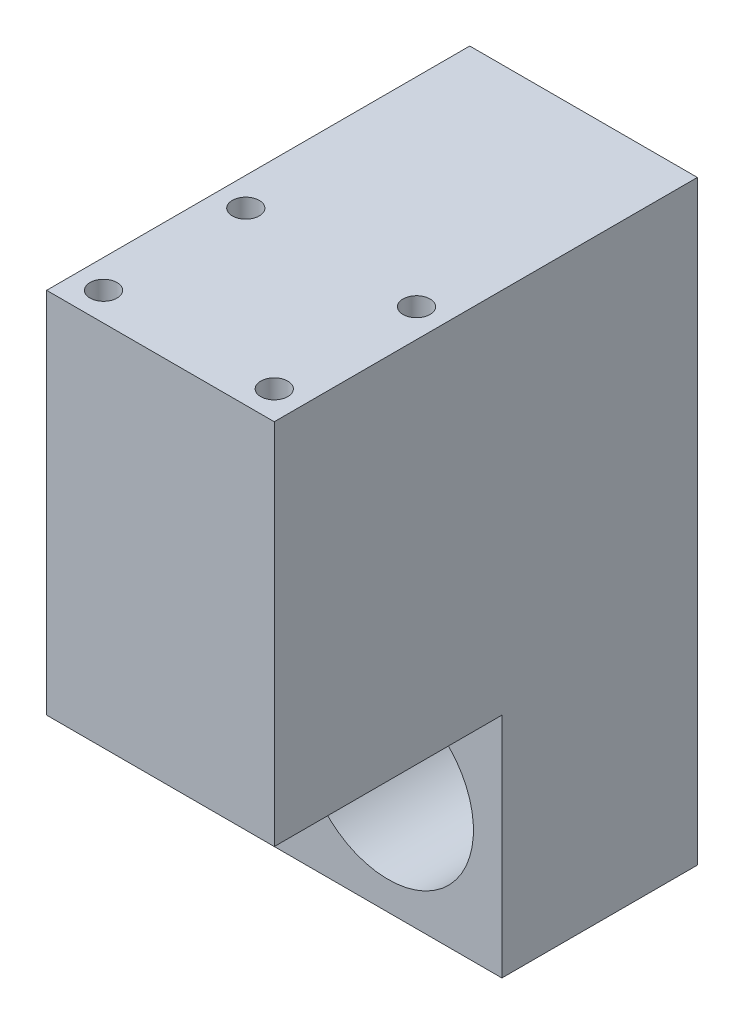
ISO-10303-21;
HEADER;
FILE_DESCRIPTION(('STEP AP214'),'2;1');
FILE_NAME('part.step','',(''),(''),'','','');
FILE_SCHEMA(('AUTOMOTIVE_DESIGN { 1 0 10303 214 1 1 1 1 }'));
ENDSEC;
DATA;
#1=APPLICATION_CONTEXT('core data for automotive mechanical design processes');
#2=APPLICATION_PROTOCOL_DEFINITION('international standard','automotive_design',2000,#1);
#3=PRODUCT_CONTEXT('',#1,'mechanical');
#4=PRODUCT('Part','Part','',(#3));
#5=PRODUCT_RELATED_PRODUCT_CATEGORY('part','',(#4));
#6=PRODUCT_DEFINITION_FORMATION('','',#4);
#7=PRODUCT_DEFINITION_CONTEXT('part definition',#1,'design');
#8=PRODUCT_DEFINITION('design','',#6,#7);
#9=PRODUCT_DEFINITION_SHAPE('','',#8);
#10=(LENGTH_UNIT() NAMED_UNIT(*) SI_UNIT(.MILLI.,.METRE.));
#11=(NAMED_UNIT(*) PLANE_ANGLE_UNIT() SI_UNIT($,.RADIAN.));
#12=(NAMED_UNIT(*) SI_UNIT($,.STERADIAN.) SOLID_ANGLE_UNIT());
#13=UNCERTAINTY_MEASURE_WITH_UNIT(LENGTH_MEASURE(1.E-05),#10,'distance_accuracy_value','');
#14=(GEOMETRIC_REPRESENTATION_CONTEXT(3) GLOBAL_UNCERTAINTY_ASSIGNED_CONTEXT((#13)) GLOBAL_UNIT_ASSIGNED_CONTEXT((#10,
#11,#12)) REPRESENTATION_CONTEXT('',''));
#15=CARTESIAN_POINT('',(0.,0.,0.));
#16=DIRECTION('',(0.,0.,1.));
#17=DIRECTION('',(1.,0.,0.));
#18=AXIS2_PLACEMENT_3D('',#15,#16,#17);
#19=CARTESIAN_POINT('',(-18.3087248322148,8.,2.98570469798658));
#20=DIRECTION('',(0.,0.,1.));
#21=DIRECTION('',(1.,0.,0.));
#22=AXIS2_PLACEMENT_3D('',#19,#20,#21);
#23=PLANE('',#22);
#24=DIRECTION('',(-1.,0.,0.));
#25=VECTOR('',#24,1.);
#26=CARTESIAN_POINT('',(-18.3087248322148,0.,2.98570469798658));
#27=LINE('',#26,#25);
#28=CARTESIAN_POINT('',(-10.3087248322148,0.,2.98570469798658));
#29=VERTEX_POINT('',#28);
#30=CARTESIAN_POINT('',(-18.3087248322148,0.,2.98570469798658));
#31=VERTEX_POINT('',#30);
#32=EDGE_CURVE('E89',#29,#31,#27,.T.);
#33=ORIENTED_EDGE('',*,*,#32,.T.);
#34=DIRECTION('',(0.,-1.,0.));
#35=VECTOR('',#34,1.);
#36=CARTESIAN_POINT('',(-18.3087248322148,8.,2.98570469798658));
#37=LINE('',#36,#35);
#38=CARTESIAN_POINT('',(-18.3087248322148,20.93,2.98570469798658));
#39=VERTEX_POINT('',#38);
#40=EDGE_CURVE('E99',#39,#31,#37,.T.);
#41=ORIENTED_EDGE('',*,*,#40,.F.);
#42=DIRECTION('',(-1.,0.,0.));
#43=VECTOR('',#42,1.);
#44=CARTESIAN_POINT('',(-18.3087248322148,20.93,2.98570469798658));
#45=LINE('',#44,#43);
#46=CARTESIAN_POINT('',(-10.3087248322148,20.93,2.98570469798658));
#47=VERTEX_POINT('',#46);
#48=EDGE_CURVE('E97',#47,#39,#45,.T.);
#49=ORIENTED_EDGE('',*,*,#48,.F.);
#50=DIRECTION('',(0.,-1.,0.));
#51=VECTOR('',#50,1.);
#52=CARTESIAN_POINT('',(-10.3087248322148,8.,2.98570469798658));
#53=LINE('',#52,#51);
#54=EDGE_CURVE('E84',#47,#29,#53,.T.);
#55=ORIENTED_EDGE('',*,*,#54,.T.);
#56=EDGE_LOOP('',(#33,#41,#49,#55));
#57=FACE_BOUND('',#56,.T.);
#58=CARTESIAN_POINT('',(-14.3087248322148,4.,2.98570469798657));
#59=DIRECTION('',(0.,0.,-1.));
#60=DIRECTION('',(-1.,0.,0.));
#61=AXIS2_PLACEMENT_3D('',#58,#59,#60);
#62=CIRCLE('',#61,2.99999999999999);
#63=CARTESIAN_POINT('',(-17.3087248322148,4.,2.98570469798657));
#64=VERTEX_POINT('',#63);
#65=EDGE_CURVE('E186',#64,#64,#62,.T.);
#66=ORIENTED_EDGE('',*,*,#65,.F.);
#67=EDGE_LOOP('',(#66));
#68=FACE_BOUND('',#67,.T.);
#69=ADVANCED_FACE('F50',(#57,#68),#23,.F.);
#70=CARTESIAN_POINT('',(-18.3087248322148,8.,9.85570469798658));
#71=DIRECTION('',(1.,0.,0.));
#72=DIRECTION('',(0.,0.,-1.));
#73=AXIS2_PLACEMENT_3D('',#70,#71,#72);
#74=PLANE('',#73);
#75=DIRECTION('',(0.,0.,1.));
#76=VECTOR('',#75,1.);
#77=CARTESIAN_POINT('',(-18.3087248322148,0.,9.85570469798658));
#78=LINE('',#77,#76);
#79=CARTESIAN_POINT('',(-18.3087248322148,0.,9.85570469798658));
#80=VERTEX_POINT('',#79);
#81=EDGE_CURVE('E104',#31,#80,#78,.T.);
#82=ORIENTED_EDGE('',*,*,#81,.T.);
#83=DIRECTION('',(0.,-1.,0.));
#84=VECTOR('',#83,1.);
#85=CARTESIAN_POINT('',(-18.3087248322148,8.,9.85570469798658));
#86=LINE('',#85,#84);
#87=CARTESIAN_POINT('',(-18.3087248322148,8.,9.85570469798658));
#88=VERTEX_POINT('',#87);
#89=EDGE_CURVE('E11',#88,#80,#86,.T.);
#90=ORIENTED_EDGE('',*,*,#89,.F.);
#91=DIRECTION('',(0.,0.,1.));
#92=VECTOR('',#91,1.);
#93=CARTESIAN_POINT('',(-18.3087248322148,8.,2.98570469798658));
#94=LINE('',#93,#92);
#95=CARTESIAN_POINT('',(-18.3087248322148,8.,17.8557046979866));
#96=VERTEX_POINT('',#95);
#97=EDGE_CURVE('E134',#88,#96,#94,.T.);
#98=ORIENTED_EDGE('',*,*,#97,.T.);
#99=DIRECTION('',(0.,-1.,0.));
#100=VECTOR('',#99,1.);
#101=CARTESIAN_POINT('',(-18.3087248322148,20.93,17.8557046979866));
#102=LINE('',#101,#100);
#103=CARTESIAN_POINT('',(-18.3087248322148,20.93,17.8557046979866));
#104=VERTEX_POINT('',#103);
#105=EDGE_CURVE('E124',#104,#96,#102,.T.);
#106=ORIENTED_EDGE('',*,*,#105,.F.);
#107=DIRECTION('',(0.,0.,1.));
#108=VECTOR('',#107,1.);
#109=CARTESIAN_POINT('',(-18.3087248322148,20.93,2.98570469798658));
#110=LINE('',#109,#108);
#111=EDGE_CURVE('E113',#39,#104,#110,.T.);
#112=ORIENTED_EDGE('',*,*,#111,.F.);
#113=ORIENTED_EDGE('',*,*,#40,.T.);
#114=EDGE_LOOP('',(#82,#90,#98,#106,#112,#113));
#115=FACE_BOUND('',#114,.T.);
#116=ADVANCED_FACE('F47',(#115),#74,.F.);
#117=CARTESIAN_POINT('',(-18.3087248322148,8.,9.85570469798658));
#118=DIRECTION('',(0.,0.,-1.));
#119=DIRECTION('',(-1.,0.,0.));
#120=AXIS2_PLACEMENT_3D('',#117,#118,#119);
#121=PLANE('',#120);
#122=CARTESIAN_POINT('',(-14.3087248322148,4.,9.85570469798658));
#123=DIRECTION('',(0.,0.,-1.));
#124=DIRECTION('',(-1.,0.,0.));
#125=AXIS2_PLACEMENT_3D('',#122,#123,#124);
#126=CIRCLE('',#125,2.99999999999999);
#127=CARTESIAN_POINT('',(-17.3087248322148,4.,9.85570469798658));
#128=VERTEX_POINT('',#127);
#129=EDGE_CURVE('E184',#128,#128,#126,.T.);
#130=ORIENTED_EDGE('',*,*,#129,.T.);
#131=EDGE_LOOP('',(#130));
#132=FACE_BOUND('',#131,.T.);
#133=DIRECTION('',(1.,0.,0.));
#134=VECTOR('',#133,1.);
#135=CARTESIAN_POINT('',(-18.3087248322148,0.,9.85570469798658));
#136=LINE('',#135,#134);
#137=CARTESIAN_POINT('',(-10.3087248322148,0.,9.85570469798658));
#138=VERTEX_POINT('',#137);
#139=EDGE_CURVE('E93',#80,#138,#136,.T.);
#140=ORIENTED_EDGE('',*,*,#139,.T.);
#141=DIRECTION('',(0.,-1.,0.));
#142=VECTOR('',#141,1.);
#143=CARTESIAN_POINT('',(-10.3087248322148,8.,9.85570469798658));
#144=LINE('',#143,#142);
#145=CARTESIAN_POINT('',(-10.3087248322148,8.,9.85570469798658));
#146=VERTEX_POINT('',#145);
#147=EDGE_CURVE('E57',#146,#138,#144,.T.);
#148=ORIENTED_EDGE('',*,*,#147,.F.);
#149=DIRECTION('',(1.,0.,0.));
#150=VECTOR('',#149,1.);
#151=CARTESIAN_POINT('',(-18.3087248322148,8.,9.85570469798658));
#152=LINE('',#151,#150);
#153=EDGE_CURVE('E61',#88,#146,#152,.T.);
#154=ORIENTED_EDGE('',*,*,#153,.F.);
#155=ORIENTED_EDGE('',*,*,#89,.T.);
#156=EDGE_LOOP('',(#140,#148,#154,#155));
#157=FACE_BOUND('',#156,.T.);
#158=ADVANCED_FACE('F142',(#132,#157),#121,.F.);
#159=CARTESIAN_POINT('',(-10.3087248322148,8.,9.85570469798658));
#160=DIRECTION('',(-1.,0.,0.));
#161=DIRECTION('',(0.,0.,1.));
#162=AXIS2_PLACEMENT_3D('',#159,#160,#161);
#163=PLANE('',#162);
#164=DIRECTION('',(0.,0.,-1.));
#165=VECTOR('',#164,1.);
#166=CARTESIAN_POINT('',(-10.3087248322148,0.,9.85570469798658));
#167=LINE('',#166,#165);
#168=EDGE_CURVE('E77',#138,#29,#167,.T.);
#169=ORIENTED_EDGE('',*,*,#168,.T.);
#170=ORIENTED_EDGE('',*,*,#54,.F.);
#171=DIRECTION('',(0.,0.,-1.));
#172=VECTOR('',#171,1.);
#173=CARTESIAN_POINT('',(-10.3087248322148,20.93,2.98570469798658));
#174=LINE('',#173,#172);
#175=CARTESIAN_POINT('',(-10.3087248322148,20.93,17.8557046979866));
#176=VERTEX_POINT('',#175);
#177=EDGE_CURVE('E121',#176,#47,#174,.T.);
#178=ORIENTED_EDGE('',*,*,#177,.F.);
#179=DIRECTION('',(0.,-1.,0.));
#180=VECTOR('',#179,1.);
#181=CARTESIAN_POINT('',(-10.3087248322148,20.93,17.8557046979866));
#182=LINE('',#181,#180);
#183=CARTESIAN_POINT('',(-10.3087248322148,8.,17.8557046979866));
#184=VERTEX_POINT('',#183);
#185=EDGE_CURVE('E125',#176,#184,#182,.T.);
#186=ORIENTED_EDGE('',*,*,#185,.T.);
#187=DIRECTION('',(0.,0.,-1.));
#188=VECTOR('',#187,1.);
#189=CARTESIAN_POINT('',(-10.3087248322148,8.,2.98570469798658));
#190=LINE('',#189,#188);
#191=EDGE_CURVE('E137',#184,#146,#190,.T.);
#192=ORIENTED_EDGE('',*,*,#191,.T.);
#193=ORIENTED_EDGE('',*,*,#147,.T.);
#194=EDGE_LOOP('',(#169,#170,#178,#186,#192,#193));
#195=FACE_BOUND('',#194,.T.);
#196=ADVANCED_FACE('F85',(#195),#163,.F.);
#197=CARTESIAN_POINT('',(0.,0.,0.));
#198=DIRECTION('',(0.,-1.,0.));
#199=DIRECTION('',(0.,0.,-1.));
#200=AXIS2_PLACEMENT_3D('',#197,#198,#199);
#201=PLANE('',#200);
#202=ORIENTED_EDGE('',*,*,#81,.F.);
#203=ORIENTED_EDGE('',*,*,#32,.F.);
#204=ORIENTED_EDGE('',*,*,#168,.F.);
#205=ORIENTED_EDGE('',*,*,#139,.F.);
#206=EDGE_LOOP('',(#202,#203,#204,#205));
#207=FACE_BOUND('',#206,.T.);
#208=ADVANCED_FACE('F103',(#207),#201,.T.);
#209=CARTESIAN_POINT('',(0.,8.,0.));
#210=DIRECTION('',(0.,1.,0.));
#211=DIRECTION('',(0.,0.,1.));
#212=AXIS2_PLACEMENT_3D('',#209,#210,#211);
#213=PLANE('',#212);
#214=CARTESIAN_POINT('',(-17.3087248322148,8.,11.8557046979866));
#215=DIRECTION('',(0.,1.,0.));
#216=DIRECTION('',(0.,0.,1.));
#217=AXIS2_PLACEMENT_3D('',#214,#215,#216);
#218=CIRCLE('',#217,0.474999999999996);
#219=CARTESIAN_POINT('',(-17.3087248322148,8.,12.3307046979866));
#220=VERTEX_POINT('',#219);
#221=EDGE_CURVE('E177',#220,#220,#218,.T.);
#222=ORIENTED_EDGE('',*,*,#221,.T.);
#223=EDGE_LOOP('',(#222));
#224=FACE_BOUND('',#223,.T.);
#225=CARTESIAN_POINT('',(-11.3087248322148,8.,11.8557046979866));
#226=DIRECTION('',(0.,1.,0.));
#227=DIRECTION('',(0.,0.,1.));
#228=AXIS2_PLACEMENT_3D('',#225,#226,#227);
#229=CIRCLE('',#228,0.474999999999997);
#230=CARTESIAN_POINT('',(-11.3087248322148,8.,12.3307046979866));
#231=VERTEX_POINT('',#230);
#232=EDGE_CURVE('E171',#231,#231,#229,.T.);
#233=ORIENTED_EDGE('',*,*,#232,.T.);
#234=EDGE_LOOP('',(#233));
#235=FACE_BOUND('',#234,.T.);
#236=CARTESIAN_POINT('',(-17.3087248322148,8.,16.8557046979866));
#237=DIRECTION('',(0.,1.,0.));
#238=DIRECTION('',(0.,0.,1.));
#239=AXIS2_PLACEMENT_3D('',#236,#237,#238);
#240=CIRCLE('',#239,0.474999999999996);
#241=CARTESIAN_POINT('',(-17.3087248322148,8.,17.3307046979866));
#242=VERTEX_POINT('',#241);
#243=EDGE_CURVE('E167',#242,#242,#240,.T.);
#244=ORIENTED_EDGE('',*,*,#243,.T.);
#245=EDGE_LOOP('',(#244));
#246=FACE_BOUND('',#245,.T.);
#247=CARTESIAN_POINT('',(-11.3087248322148,8.,16.8557046979866));
#248=DIRECTION('',(0.,1.,0.));
#249=DIRECTION('',(0.,0.,1.));
#250=AXIS2_PLACEMENT_3D('',#247,#248,#249);
#251=CIRCLE('',#250,0.474999999999997);
#252=CARTESIAN_POINT('',(-11.3087248322148,8.,17.3307046979866));
#253=VERTEX_POINT('',#252);
#254=EDGE_CURVE('E132',#253,#253,#251,.T.);
#255=ORIENTED_EDGE('',*,*,#254,.T.);
#256=EDGE_LOOP('',(#255));
#257=FACE_BOUND('',#256,.T.);
#258=ORIENTED_EDGE('',*,*,#97,.F.);
#259=ORIENTED_EDGE('',*,*,#153,.T.);
#260=ORIENTED_EDGE('',*,*,#191,.F.);
#261=DIRECTION('',(1.,0.,0.));
#262=VECTOR('',#261,1.);
#263=CARTESIAN_POINT('',(-18.3087248322148,8.,17.8557046979866));
#264=LINE('',#263,#262);
#265=EDGE_CURVE('E133',#96,#184,#264,.T.);
#266=ORIENTED_EDGE('',*,*,#265,.F.);
#267=EDGE_LOOP('',(#258,#259,#260,#266));
#268=FACE_BOUND('',#267,.T.);
#269=ADVANCED_FACE('F150',(#224,#235,#246,#257,#268),#213,.F.);
#270=CARTESIAN_POINT('',(-18.3087248322148,20.93,17.8557046979866));
#271=DIRECTION('',(0.,0.,-1.));
#272=DIRECTION('',(-1.,0.,0.));
#273=AXIS2_PLACEMENT_3D('',#270,#271,#272);
#274=PLANE('',#273);
#275=ORIENTED_EDGE('',*,*,#265,.T.);
#276=ORIENTED_EDGE('',*,*,#185,.F.);
#277=DIRECTION('',(1.,0.,0.));
#278=VECTOR('',#277,1.);
#279=CARTESIAN_POINT('',(-18.3087248322148,20.93,17.8557046979866));
#280=LINE('',#279,#278);
#281=EDGE_CURVE('E130',#104,#176,#280,.T.);
#282=ORIENTED_EDGE('',*,*,#281,.F.);
#283=ORIENTED_EDGE('',*,*,#105,.T.);
#284=EDGE_LOOP('',(#275,#276,#282,#283));
#285=FACE_BOUND('',#284,.T.);
#286=ADVANCED_FACE('F152',(#285),#274,.F.);
#287=CARTESIAN_POINT('',(0.,20.93,0.));
#288=DIRECTION('',(0.,1.,0.));
#289=DIRECTION('',(0.,0.,1.));
#290=AXIS2_PLACEMENT_3D('',#287,#288,#289);
#291=PLANE('',#290);
#292=CARTESIAN_POINT('',(-17.3087248322148,20.93,11.8557046979866));
#293=DIRECTION('',(0.,1.,0.));
#294=DIRECTION('',(0.,0.,1.));
#295=AXIS2_PLACEMENT_3D('',#292,#293,#294);
#296=CIRCLE('',#295,0.474999999999996);
#297=CARTESIAN_POINT('',(-17.3087248322148,20.93,12.3307046979866));
#298=VERTEX_POINT('',#297);
#299=EDGE_CURVE('E182',#298,#298,#296,.T.);
#300=ORIENTED_EDGE('',*,*,#299,.F.);
#301=EDGE_LOOP('',(#300));
#302=FACE_BOUND('',#301,.T.);
#303=CARTESIAN_POINT('',(-11.3087248322148,20.93,11.8557046979866));
#304=DIRECTION('',(0.,1.,0.));
#305=DIRECTION('',(0.,0.,1.));
#306=AXIS2_PLACEMENT_3D('',#303,#304,#305);
#307=CIRCLE('',#306,0.474999999999998);
#308=CARTESIAN_POINT('',(-11.3087248322148,20.93,12.3307046979866));
#309=VERTEX_POINT('',#308);
#310=EDGE_CURVE('E172',#309,#309,#307,.T.);
#311=ORIENTED_EDGE('',*,*,#310,.F.);
#312=EDGE_LOOP('',(#311));
#313=FACE_BOUND('',#312,.T.);
#314=CARTESIAN_POINT('',(-17.3087248322148,20.93,16.8557046979866));
#315=DIRECTION('',(0.,1.,0.));
#316=DIRECTION('',(0.,0.,1.));
#317=AXIS2_PLACEMENT_3D('',#314,#315,#316);
#318=CIRCLE('',#317,0.474999999999996);
#319=CARTESIAN_POINT('',(-17.3087248322148,20.93,17.3307046979866));
#320=VERTEX_POINT('',#319);
#321=EDGE_CURVE('E166',#320,#320,#318,.T.);
#322=ORIENTED_EDGE('',*,*,#321,.F.);
#323=EDGE_LOOP('',(#322));
#324=FACE_BOUND('',#323,.T.);
#325=CARTESIAN_POINT('',(-11.3087248322148,20.93,16.8557046979866));
#326=DIRECTION('',(0.,1.,0.));
#327=DIRECTION('',(0.,0.,1.));
#328=AXIS2_PLACEMENT_3D('',#325,#326,#327);
#329=CIRCLE('',#328,0.474999999999998);
#330=CARTESIAN_POINT('',(-11.3087248322148,20.93,17.3307046979866));
#331=VERTEX_POINT('',#330);
#332=EDGE_CURVE('E162',#331,#331,#329,.T.);
#333=ORIENTED_EDGE('',*,*,#332,.F.);
#334=EDGE_LOOP('',(#333));
#335=FACE_BOUND('',#334,.T.);
#336=ORIENTED_EDGE('',*,*,#111,.T.);
#337=ORIENTED_EDGE('',*,*,#281,.T.);
#338=ORIENTED_EDGE('',*,*,#177,.T.);
#339=ORIENTED_EDGE('',*,*,#48,.T.);
#340=EDGE_LOOP('',(#336,#337,#338,#339));
#341=FACE_BOUND('',#340,.T.);
#342=ADVANCED_FACE('F120',(#302,#313,#324,#335,#341),#291,.T.);
#343=CARTESIAN_POINT('',(-11.3087248322148,20.93,16.8557046979866));
#344=DIRECTION('',(0.,1.,0.));
#345=DIRECTION('',(0.,0.,1.));
#346=AXIS2_PLACEMENT_3D('',#343,#344,#345);
#347=CYLINDRICAL_SURFACE('',#346,0.474999999999997);
#348=ORIENTED_EDGE('',*,*,#254,.F.);
#349=EDGE_LOOP('',(#348));
#350=FACE_BOUND('',#349,.T.);
#351=ORIENTED_EDGE('',*,*,#332,.T.);
#352=EDGE_LOOP('',(#351));
#353=FACE_BOUND('',#352,.T.);
#354=ADVANCED_FACE('F221',(#350,#353),#347,.F.);
#355=CARTESIAN_POINT('',(-17.3087248322148,20.93,16.8557046979866));
#356=DIRECTION('',(0.,1.,0.));
#357=DIRECTION('',(0.,0.,1.));
#358=AXIS2_PLACEMENT_3D('',#355,#356,#357);
#359=CYLINDRICAL_SURFACE('',#358,0.474999999999996);
#360=ORIENTED_EDGE('',*,*,#243,.F.);
#361=EDGE_LOOP('',(#360));
#362=FACE_BOUND('',#361,.T.);
#363=ORIENTED_EDGE('',*,*,#321,.T.);
#364=EDGE_LOOP('',(#363));
#365=FACE_BOUND('',#364,.T.);
#366=ADVANCED_FACE('F219',(#362,#365),#359,.F.);
#367=CARTESIAN_POINT('',(-11.3087248322148,20.93,11.8557046979866));
#368=DIRECTION('',(0.,1.,0.));
#369=DIRECTION('',(0.,0.,1.));
#370=AXIS2_PLACEMENT_3D('',#367,#368,#369);
#371=CYLINDRICAL_SURFACE('',#370,0.474999999999997);
#372=ORIENTED_EDGE('',*,*,#232,.F.);
#373=EDGE_LOOP('',(#372));
#374=FACE_BOUND('',#373,.T.);
#375=ORIENTED_EDGE('',*,*,#310,.T.);
#376=EDGE_LOOP('',(#375));
#377=FACE_BOUND('',#376,.T.);
#378=ADVANCED_FACE('F212',(#374,#377),#371,.F.);
#379=CARTESIAN_POINT('',(-17.3087248322148,20.93,11.8557046979866));
#380=DIRECTION('',(0.,1.,0.));
#381=DIRECTION('',(0.,0.,1.));
#382=AXIS2_PLACEMENT_3D('',#379,#380,#381);
#383=CYLINDRICAL_SURFACE('',#382,0.474999999999996);
#384=ORIENTED_EDGE('',*,*,#221,.F.);
#385=EDGE_LOOP('',(#384));
#386=FACE_BOUND('',#385,.T.);
#387=ORIENTED_EDGE('',*,*,#299,.T.);
#388=EDGE_LOOP('',(#387));
#389=FACE_BOUND('',#388,.T.);
#390=ADVANCED_FACE('F207',(#386,#389),#383,.F.);
#391=CARTESIAN_POINT('',(-14.3087248322148,4.,2.98570469798658));
#392=DIRECTION('',(0.,0.,-1.));
#393=DIRECTION('',(-1.,0.,0.));
#394=AXIS2_PLACEMENT_3D('',#391,#392,#393);
#395=CYLINDRICAL_SURFACE('',#394,2.99999999999999);
#396=ORIENTED_EDGE('',*,*,#129,.F.);
#397=EDGE_LOOP('',(#396));
#398=FACE_BOUND('',#397,.T.);
#399=ORIENTED_EDGE('',*,*,#65,.T.);
#400=EDGE_LOOP('',(#399));
#401=FACE_BOUND('',#400,.T.);
#402=ADVANCED_FACE('F191',(#398,#401),#395,.F.);
#403=CLOSED_SHELL('',(#69,#116,#158,#196,#208,#269,#286,#342,#354,#366,#378,#390,#402));
#404=MANIFOLD_SOLID_BREP('B2',#403);
#405=ADVANCED_BREP_SHAPE_REPRESENTATION('',(#18,#404),#14);
#406=SHAPE_DEFINITION_REPRESENTATION(#9,#405);
ENDSEC;
END-ISO-10303-21;
